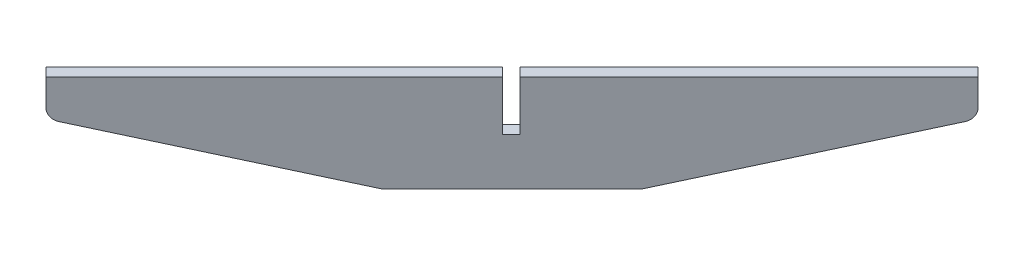
ISO-10303-21;
HEADER;
FILE_DESCRIPTION(('STEP AP214'),'2;1');
FILE_NAME('part.step','',(''),(''),'','','');
FILE_SCHEMA(('AUTOMOTIVE_DESIGN { 1 0 10303 214 1 1 1 1 }'));
ENDSEC;
DATA;
#1=APPLICATION_CONTEXT('core data for automotive mechanical design processes');
#2=APPLICATION_PROTOCOL_DEFINITION('international standard','automotive_design',2000,#1);
#3=PRODUCT_CONTEXT('',#1,'mechanical');
#4=PRODUCT('Part','Part','',(#3));
#5=PRODUCT_RELATED_PRODUCT_CATEGORY('part','',(#4));
#6=PRODUCT_DEFINITION_FORMATION('','',#4);
#7=PRODUCT_DEFINITION_CONTEXT('part definition',#1,'design');
#8=PRODUCT_DEFINITION('design','',#6,#7);
#9=PRODUCT_DEFINITION_SHAPE('','',#8);
#10=(LENGTH_UNIT() NAMED_UNIT(*) SI_UNIT(.MILLI.,.METRE.));
#11=(NAMED_UNIT(*) PLANE_ANGLE_UNIT() SI_UNIT($,.RADIAN.));
#12=(NAMED_UNIT(*) SI_UNIT($,.STERADIAN.) SOLID_ANGLE_UNIT());
#13=UNCERTAINTY_MEASURE_WITH_UNIT(LENGTH_MEASURE(1.E-05),#10,'distance_accuracy_value','');
#14=(GEOMETRIC_REPRESENTATION_CONTEXT(3) GLOBAL_UNCERTAINTY_ASSIGNED_CONTEXT((#13)) GLOBAL_UNIT_ASSIGNED_CONTEXT((#10,
#11,#12)) REPRESENTATION_CONTEXT('',''));
#15=CARTESIAN_POINT('',(0.,0.,0.));
#16=DIRECTION('',(0.,0.,1.));
#17=DIRECTION('',(1.,0.,0.));
#18=AXIS2_PLACEMENT_3D('',#15,#16,#17);
#19=CARTESIAN_POINT('',(0.,15.,0.));
#20=DIRECTION('',(0.,-1.,0.));
#21=DIRECTION('',(0.,0.,-1.));
#22=AXIS2_PLACEMENT_3D('',#19,#20,#21);
#23=PLANE('',#22);
#24=DIRECTION('',(-0.707106781186547,0.,0.707106781186548));
#25=VECTOR('',#24,1.);
#26=CARTESIAN_POINT('',(-195.,15.,187.928932188135));
#27=LINE('',#26,#25);
#28=CARTESIAN_POINT('',(187.928932188135,15.,-195.));
#29=VERTEX_POINT('',#28);
#30=CARTESIAN_POINT('',(-0.234006637984812,15.,-6.83706117388067));
#31=VERTEX_POINT('',#30);
#32=EDGE_CURVE('E228',#29,#31,#27,.T.);
#33=ORIENTED_EDGE('',*,*,#32,.T.);
#34=DIRECTION('',(0.707106781186548,0.,0.707106781186548));
#35=VECTOR('',#34,1.);
#36=CARTESIAN_POINT('',(3.30152726794796,15.,-3.30152726794796));
#37=LINE('',#36,#35);
#38=CARTESIAN_POINT('',(6.83706117388066,15.,0.234006637984791));
#39=VERTEX_POINT('',#38);
#40=EDGE_CURVE('E170',#31,#39,#37,.T.);
#41=ORIENTED_EDGE('',*,*,#40,.T.);
#42=DIRECTION('',(0.707106781186547,0.,-0.707106781186547));
#43=VECTOR('',#42,1.);
#44=CARTESIAN_POINT('',(-187.928932188135,15.,195.));
#45=LINE('',#44,#43);
#46=CARTESIAN_POINT('',(195.,15.,-187.928932188135));
#47=VERTEX_POINT('',#46);
#48=EDGE_CURVE('E232',#39,#47,#45,.T.);
#49=ORIENTED_EDGE('',*,*,#48,.T.);
#50=DIRECTION('',(-0.707106781186547,0.,-0.707106781186547));
#51=VECTOR('',#50,1.);
#52=CARTESIAN_POINT('',(187.928932188135,15.,-195.));
#53=LINE('',#52,#51);
#54=EDGE_CURVE('E235',#47,#29,#53,.T.);
#55=ORIENTED_EDGE('',*,*,#54,.T.);
#56=EDGE_LOOP('',(#33,#41,#49,#55));
#57=FACE_BOUND('',#56,.T.);
#58=ADVANCED_FACE('F35',(#57),#23,.F.);
#59=CARTESIAN_POINT('',(-195.,15.,187.928932188135));
#60=DIRECTION('',(0.707106781186548,0.,0.707106781186547));
#61=DIRECTION('',(0.707106781186547,0.,-0.707106781186548));
#62=AXIS2_PLACEMENT_3D('',#59,#60,#61);
#63=PLANE('',#62);
#64=DIRECTION('',(0.,-1.,0.));
#65=VECTOR('',#64,1.);
#66=CARTESIAN_POINT('',(187.928932188135,15.,-195.));
#67=LINE('',#66,#65);
#68=CARTESIAN_POINT('',(187.928932188135,-7.23300305550614,-195.));
#69=VERTEX_POINT('',#68);
#70=EDGE_CURVE('E200',#29,#69,#67,.T.);
#71=ORIENTED_EDGE('',*,*,#70,.T.);
#72=CARTESIAN_POINT('',(180.857864376269,-7.23300305550614,-187.928932188135));
#73=DIRECTION('',(0.707106781186548,0.,0.707106781186547));
#74=DIRECTION('',(0.707106781186547,0.,-0.707106781186548));
#75=AXIS2_PLACEMENT_3D('',#72,#73,#74);
#76=CIRCLE('',#75,10.);
#77=CARTESIAN_POINT('',(182.60764553352,-16.9219932920304,-189.678713345385));
#78=VERTEX_POINT('',#77);
#79=EDGE_CURVE('E176',#69,#78,#76,.F.);
#80=ORIENTED_EDGE('',*,*,#79,.T.);
#81=DIRECTION('',(0.685115069909655,0.247456424376855,-0.685115069909655));
#82=VECTOR('',#81,1.);
#83=CARTESIAN_POINT('',(187.928932188135,-15.,-195.));
#84=LINE('',#83,#82);
#85=CARTESIAN_POINT('',(49.4974746830583,-65.,-56.5685424949238));
#86=VERTEX_POINT('',#85);
#87=EDGE_CURVE('E210',#86,#78,#84,.T.);
#88=ORIENTED_EDGE('',*,*,#87,.F.);
#89=DIRECTION('',(0.707106781186548,0.,-0.707106781186548));
#90=VECTOR('',#89,1.);
#91=CARTESIAN_POINT('',(49.4974746830583,-65.,-56.5685424949238));
#92=LINE('',#91,#90);
#93=CARTESIAN_POINT('',(-56.5685424949238,-65.,49.4974746830583));
#94=VERTEX_POINT('',#93);
#95=EDGE_CURVE('E219',#94,#86,#92,.T.);
#96=ORIENTED_EDGE('',*,*,#95,.F.);
#97=DIRECTION('',(0.685115069909655,-0.247456424376855,-0.685115069909655));
#98=VECTOR('',#97,1.);
#99=CARTESIAN_POINT('',(-56.5685424949238,-65.,49.4974746830583));
#100=LINE('',#99,#98);
#101=CARTESIAN_POINT('',(-189.678713345385,-16.9219932920304,182.60764553352));
#102=VERTEX_POINT('',#101);
#103=EDGE_CURVE('E134',#102,#94,#100,.T.);
#104=ORIENTED_EDGE('',*,*,#103,.F.);
#105=CARTESIAN_POINT('',(-187.928932188135,-7.23300305550615,180.857864376269));
#106=DIRECTION('',(0.707106781186548,0.,0.707106781186547));
#107=DIRECTION('',(0.707106781186547,0.,-0.707106781186548));
#108=AXIS2_PLACEMENT_3D('',#105,#106,#107);
#109=CIRCLE('',#108,10.);
#110=CARTESIAN_POINT('',(-195.,-7.23300305550615,187.928932188135));
#111=VERTEX_POINT('',#110);
#112=EDGE_CURVE('E174',#102,#111,#109,.F.);
#113=ORIENTED_EDGE('',*,*,#112,.T.);
#114=DIRECTION('',(0.,-1.,0.));
#115=VECTOR('',#114,1.);
#116=CARTESIAN_POINT('',(-195.,15.,187.928932188135));
#117=LINE('',#116,#115);
#118=CARTESIAN_POINT('',(-195.,15.,187.928932188135));
#119=VERTEX_POINT('',#118);
#120=EDGE_CURVE('E189',#119,#111,#117,.T.);
#121=ORIENTED_EDGE('',*,*,#120,.F.);
#122=CARTESIAN_POINT('',(-7.44649580608758,15.,0.375427994222106));
#123=VERTEX_POINT('',#122);
#124=EDGE_CURVE('E148',#123,#119,#27,.T.);
#125=ORIENTED_EDGE('',*,*,#124,.F.);
#126=DIRECTION('',(0.,-1.,0.));
#127=VECTOR('',#126,1.);
#128=CARTESIAN_POINT('',(-7.44649580608753,15.,0.37542799422205));
#129=LINE('',#128,#127);
#130=CARTESIAN_POINT('',(-7.44649580608753,-26.,0.375427994222077));
#131=VERTEX_POINT('',#130);
#132=EDGE_CURVE('E139',#123,#131,#129,.T.);
#133=ORIENTED_EDGE('',*,*,#132,.T.);
#134=DIRECTION('',(0.707106781186547,0.,-0.707106781186548));
#135=VECTOR('',#134,1.);
#136=CARTESIAN_POINT('',(-195.,-26.,187.928932188135));
#137=LINE('',#136,#135);
#138=CARTESIAN_POINT('',(-0.234006637984743,-26.,-6.83706117388072));
#139=VERTEX_POINT('',#138);
#140=EDGE_CURVE('E124',#131,#139,#137,.T.);
#141=ORIENTED_EDGE('',*,*,#140,.T.);
#142=DIRECTION('',(0.,1.,0.));
#143=VECTOR('',#142,1.);
#144=CARTESIAN_POINT('',(-0.234006637984813,15.,-6.83706117388069));
#145=LINE('',#144,#143);
#146=EDGE_CURVE('E135',#139,#31,#145,.T.);
#147=ORIENTED_EDGE('',*,*,#146,.T.);
#148=ORIENTED_EDGE('',*,*,#32,.F.);
#149=EDGE_LOOP('',(#71,#80,#88,#96,#104,#113,#121,#125,#133,#141,#147,#148));
#150=FACE_BOUND('',#149,.T.);
#151=ADVANCED_FACE('F146',(#150),#63,.F.);
#152=CARTESIAN_POINT('',(-195.,15.,187.928932188135));
#153=DIRECTION('',(0.707106781186547,0.,-0.707106781186547));
#154=DIRECTION('',(-0.707106781186548,0.,-0.707106781186548));
#155=AXIS2_PLACEMENT_3D('',#152,#153,#154);
#156=PLANE('',#155);
#157=ORIENTED_EDGE('',*,*,#120,.T.);
#158=DIRECTION('',(0.707106781186548,0.,0.707106781186548));
#159=VECTOR('',#158,1.);
#160=CARTESIAN_POINT('',(-195.,-7.23300305550615,187.928932188135));
#161=LINE('',#160,#159);
#162=CARTESIAN_POINT('',(-187.928932188135,-7.23300305550615,195.));
#163=VERTEX_POINT('',#162);
#164=EDGE_CURVE('E43',#111,#163,#161,.T.);
#165=ORIENTED_EDGE('',*,*,#164,.T.);
#166=DIRECTION('',(0.,-1.,0.));
#167=VECTOR('',#166,1.);
#168=CARTESIAN_POINT('',(-187.928932188135,15.,195.));
#169=LINE('',#168,#167);
#170=CARTESIAN_POINT('',(-187.928932188135,15.,195.));
#171=VERTEX_POINT('',#170);
#172=EDGE_CURVE('E187',#171,#163,#169,.T.);
#173=ORIENTED_EDGE('',*,*,#172,.F.);
#174=DIRECTION('',(0.707106781186548,0.,0.707106781186548));
#175=VECTOR('',#174,1.);
#176=CARTESIAN_POINT('',(-195.,15.,187.928932188135));
#177=LINE('',#176,#175);
#178=EDGE_CURVE('E231',#119,#171,#177,.T.);
#179=ORIENTED_EDGE('',*,*,#178,.F.);
#180=EDGE_LOOP('',(#157,#165,#173,#179));
#181=FACE_BOUND('',#180,.T.);
#182=ADVANCED_FACE('F185',(#181),#156,.F.);
#183=CARTESIAN_POINT('',(-187.928932188135,15.,195.));
#184=DIRECTION('',(-0.707106781186547,0.,-0.707106781186547));
#185=DIRECTION('',(-0.707106781186547,0.,0.707106781186548));
#186=AXIS2_PLACEMENT_3D('',#183,#184,#185);
#187=PLANE('',#186);
#188=DIRECTION('',(0.685115069909655,0.247456424376855,-0.685115069909655));
#189=VECTOR('',#188,1.);
#190=CARTESIAN_POINT('',(195.,-15.,-187.928932188134));
#191=LINE('',#190,#189);
#192=CARTESIAN_POINT('',(56.5685424949238,-65.,-49.4974746830583));
#193=VERTEX_POINT('',#192);
#194=CARTESIAN_POINT('',(189.678713345385,-16.9219932920304,-182.60764553352));
#195=VERTEX_POINT('',#194);
#196=EDGE_CURVE('E213',#193,#195,#191,.T.);
#197=ORIENTED_EDGE('',*,*,#196,.T.);
#198=CARTESIAN_POINT('',(187.928932188135,-7.23300305550614,-180.857864376269));
#199=DIRECTION('',(-0.707106781186547,0.,-0.707106781186547));
#200=DIRECTION('',(-0.707106781186547,0.,0.707106781186548));
#201=AXIS2_PLACEMENT_3D('',#198,#199,#200);
#202=CIRCLE('',#201,10.);
#203=CARTESIAN_POINT('',(195.,-7.23300305550614,-187.928932188135));
#204=VERTEX_POINT('',#203);
#205=EDGE_CURVE('E181',#195,#204,#202,.F.);
#206=ORIENTED_EDGE('',*,*,#205,.T.);
#207=DIRECTION('',(0.,-1.,0.));
#208=VECTOR('',#207,1.);
#209=CARTESIAN_POINT('',(195.,15.,-187.928932188135));
#210=LINE('',#209,#208);
#211=EDGE_CURVE('E195',#47,#204,#210,.T.);
#212=ORIENTED_EDGE('',*,*,#211,.F.);
#213=ORIENTED_EDGE('',*,*,#48,.F.);
#214=DIRECTION('',(0.,-1.,0.));
#215=VECTOR('',#214,1.);
#216=CARTESIAN_POINT('',(6.83706117388072,15.,0.234006637984729));
#217=LINE('',#216,#215);
#218=CARTESIAN_POINT('',(6.83706117388069,-26.,0.234006637984729));
#219=VERTEX_POINT('',#218);
#220=EDGE_CURVE('E149',#39,#219,#217,.T.);
#221=ORIENTED_EDGE('',*,*,#220,.T.);
#222=DIRECTION('',(-0.707106781186547,0.,0.707106781186548));
#223=VECTOR('',#222,1.);
#224=CARTESIAN_POINT('',(-187.928932188135,-26.,195.));
#225=LINE('',#224,#223);
#226=CARTESIAN_POINT('',(-0.37542799422205,-26.,7.44649580608756));
#227=VERTEX_POINT('',#226);
#228=EDGE_CURVE('E165',#219,#227,#225,.T.);
#229=ORIENTED_EDGE('',*,*,#228,.T.);
#230=DIRECTION('',(0.,1.,0.));
#231=VECTOR('',#230,1.);
#232=CARTESIAN_POINT('',(-0.37542799422205,15.,7.4464958060875));
#233=LINE('',#232,#231);
#234=CARTESIAN_POINT('',(-0.375427994222113,15.,7.44649580608756));
#235=VERTEX_POINT('',#234);
#236=EDGE_CURVE('E142',#227,#235,#233,.T.);
#237=ORIENTED_EDGE('',*,*,#236,.T.);
#238=EDGE_CURVE('E194',#171,#235,#45,.T.);
#239=ORIENTED_EDGE('',*,*,#238,.F.);
#240=ORIENTED_EDGE('',*,*,#172,.T.);
#241=CARTESIAN_POINT('',(-180.857864376269,-7.23300305550615,187.928932188135));
#242=DIRECTION('',(-0.707106781186547,0.,-0.707106781186547));
#243=DIRECTION('',(-0.707106781186547,0.,0.707106781186548));
#244=AXIS2_PLACEMENT_3D('',#241,#242,#243);
#245=CIRCLE('',#244,10.);
#246=CARTESIAN_POINT('',(-182.60764553352,-16.9219932920304,189.678713345385));
#247=VERTEX_POINT('',#246);
#248=EDGE_CURVE('E50',#163,#247,#245,.F.);
#249=ORIENTED_EDGE('',*,*,#248,.T.);
#250=DIRECTION('',(0.685115069909655,-0.247456424376855,-0.685115069909655));
#251=VECTOR('',#250,1.);
#252=CARTESIAN_POINT('',(-49.4974746830583,-65.,56.5685424949238));
#253=LINE('',#252,#251);
#254=CARTESIAN_POINT('',(-49.4974746830583,-65.,56.5685424949238));
#255=VERTEX_POINT('',#254);
#256=EDGE_CURVE('E207',#247,#255,#253,.T.);
#257=ORIENTED_EDGE('',*,*,#256,.T.);
#258=DIRECTION('',(0.707106781186548,0.,-0.707106781186548));
#259=VECTOR('',#258,1.);
#260=CARTESIAN_POINT('',(56.5685424949238,-65.,-49.4974746830583));
#261=LINE('',#260,#259);
#262=EDGE_CURVE('E209',#255,#193,#261,.T.);
#263=ORIENTED_EDGE('',*,*,#262,.T.);
#264=EDGE_LOOP('',(#197,#206,#212,#213,#221,#229,#237,#239,#240,#249,#257,#263));
#265=FACE_BOUND('',#264,.T.);
#266=ADVANCED_FACE('F192',(#265),#187,.F.);
#267=CARTESIAN_POINT('',(187.928932188135,15.,-195.));
#268=DIRECTION('',(-0.707106781186547,0.,0.707106781186547));
#269=DIRECTION('',(0.707106781186548,0.,0.707106781186548));
#270=AXIS2_PLACEMENT_3D('',#267,#268,#269);
#271=PLANE('',#270);
#272=ORIENTED_EDGE('',*,*,#211,.T.);
#273=DIRECTION('',(-0.707106781186548,0.,-0.707106781186548));
#274=VECTOR('',#273,1.);
#275=CARTESIAN_POINT('',(187.928932188135,-7.23300305550614,-195.));
#276=LINE('',#275,#274);
#277=EDGE_CURVE('E169',#204,#69,#276,.T.);
#278=ORIENTED_EDGE('',*,*,#277,.T.);
#279=ORIENTED_EDGE('',*,*,#70,.F.);
#280=ORIENTED_EDGE('',*,*,#54,.F.);
#281=EDGE_LOOP('',(#272,#278,#279,#280));
#282=FACE_BOUND('',#281,.T.);
#283=ADVANCED_FACE('F242',(#282),#271,.F.);
#284=ORIENTED_EDGE('',*,*,#238,.T.);
#285=DIRECTION('',(-0.707106781186548,0.,-0.707106781186548));
#286=VECTOR('',#285,1.);
#287=CARTESIAN_POINT('',(-3.91096190015482,15.,3.91096190015482));
#288=LINE('',#287,#286);
#289=EDGE_CURVE('E197',#235,#123,#288,.T.);
#290=ORIENTED_EDGE('',*,*,#289,.T.);
#291=ORIENTED_EDGE('',*,*,#124,.T.);
#292=ORIENTED_EDGE('',*,*,#178,.T.);
#293=EDGE_LOOP('',(#284,#290,#291,#292));
#294=FACE_BOUND('',#293,.T.);
#295=ADVANCED_FACE('F262',(#294),#23,.F.);
#296=CARTESIAN_POINT('',(-49.4974746830583,-65.,56.5685424949238));
#297=DIRECTION('',(0.17497811572505,0.968899023652425,-0.17497811572505));
#298=DIRECTION('',(0.,0.177719921285182,0.984081109247804));
#299=AXIS2_PLACEMENT_3D('',#296,#297,#298);
#300=PLANE('',#299);
#301=ORIENTED_EDGE('',*,*,#256,.F.);
#302=DIRECTION('',(0.707106781186548,0.,0.707106781186548));
#303=VECTOR('',#302,1.);
#304=CARTESIAN_POINT('',(-182.60764553352,-16.9219932920304,189.678713345385));
#305=LINE('',#304,#303);
#306=EDGE_CURVE('E12',#247,#102,#305,.F.);
#307=ORIENTED_EDGE('',*,*,#306,.T.);
#308=ORIENTED_EDGE('',*,*,#103,.T.);
#309=DIRECTION('',(-0.707106781186548,0.,-0.707106781186548));
#310=VECTOR('',#309,1.);
#311=CARTESIAN_POINT('',(-49.4974746830583,-65.,56.5685424949238));
#312=LINE('',#311,#310);
#313=EDGE_CURVE('E225',#255,#94,#312,.T.);
#314=ORIENTED_EDGE('',*,*,#313,.F.);
#315=EDGE_LOOP('',(#301,#307,#308,#314));
#316=FACE_BOUND('',#315,.T.);
#317=ADVANCED_FACE('F260',(#316),#300,.F.);
#318=CARTESIAN_POINT('',(56.5685424949238,-65.,-49.4974746830583));
#319=DIRECTION('',(0.,1.,0.));
#320=DIRECTION('',(0.,0.,1.));
#321=AXIS2_PLACEMENT_3D('',#318,#319,#320);
#322=PLANE('',#321);
#323=ORIENTED_EDGE('',*,*,#95,.T.);
#324=DIRECTION('',(-0.707106781186548,0.,-0.707106781186548));
#325=VECTOR('',#324,1.);
#326=CARTESIAN_POINT('',(56.5685424949238,-65.,-49.4974746830583));
#327=LINE('',#326,#325);
#328=EDGE_CURVE('E216',#193,#86,#327,.T.);
#329=ORIENTED_EDGE('',*,*,#328,.F.);
#330=ORIENTED_EDGE('',*,*,#262,.F.);
#331=ORIENTED_EDGE('',*,*,#313,.T.);
#332=EDGE_LOOP('',(#323,#329,#330,#331));
#333=FACE_BOUND('',#332,.T.);
#334=ADVANCED_FACE('F256',(#333),#322,.F.);
#335=CARTESIAN_POINT('',(195.,-15.,-187.928932188134));
#336=DIRECTION('',(-0.17497811572505,0.968899023652425,0.17497811572505));
#337=DIRECTION('',(0.,-0.177719921285182,0.984081109247804));
#338=AXIS2_PLACEMENT_3D('',#335,#336,#337);
#339=PLANE('',#338);
#340=ORIENTED_EDGE('',*,*,#87,.T.);
#341=DIRECTION('',(-0.707106781186548,0.,-0.707106781186548));
#342=VECTOR('',#341,1.);
#343=CARTESIAN_POINT('',(189.678713345385,-16.9219932920304,-182.60764553352));
#344=LINE('',#343,#342);
#345=EDGE_CURVE('E178',#78,#195,#344,.F.);
#346=ORIENTED_EDGE('',*,*,#345,.T.);
#347=ORIENTED_EDGE('',*,*,#196,.F.);
#348=ORIENTED_EDGE('',*,*,#328,.T.);
#349=EDGE_LOOP('',(#340,#346,#347,#348));
#350=FACE_BOUND('',#349,.T.);
#351=ADVANCED_FACE('F251',(#350),#339,.F.);
#352=CARTESIAN_POINT('',(-198.910961900155,-26.,-191.089038099845));
#353=DIRECTION('',(0.,-1.,0.));
#354=DIRECTION('',(0.,0.,-1.));
#355=AXIS2_PLACEMENT_3D('',#352,#353,#354);
#356=PLANE('',#355);
#357=DIRECTION('',(0.707106781186548,0.,0.707106781186548));
#358=VECTOR('',#357,1.);
#359=CARTESIAN_POINT('',(-198.910961900155,-26.,-191.089038099845));
#360=LINE('',#359,#358);
#361=EDGE_CURVE('E127',#131,#227,#360,.T.);
#362=ORIENTED_EDGE('',*,*,#361,.T.);
#363=ORIENTED_EDGE('',*,*,#228,.F.);
#364=DIRECTION('',(0.707106781186548,0.,0.707106781186548));
#365=VECTOR('',#364,1.);
#366=CARTESIAN_POINT('',(-191.698472732052,-26.,-198.301527267948));
#367=LINE('',#366,#365);
#368=EDGE_CURVE('E130',#139,#219,#367,.T.);
#369=ORIENTED_EDGE('',*,*,#368,.F.);
#370=ORIENTED_EDGE('',*,*,#140,.F.);
#371=EDGE_LOOP('',(#362,#363,#369,#370));
#372=FACE_BOUND('',#371,.T.);
#373=ADVANCED_FACE('F126',(#372),#356,.F.);
#374=CARTESIAN_POINT('',(-191.698472732052,-26.,-198.301527267948));
#375=DIRECTION('',(0.707106781186548,0.,-0.707106781186548));
#376=DIRECTION('',(-0.707106781186548,0.,-0.707106781186548));
#377=AXIS2_PLACEMENT_3D('',#374,#375,#376);
#378=PLANE('',#377);
#379=ORIENTED_EDGE('',*,*,#368,.T.);
#380=ORIENTED_EDGE('',*,*,#220,.F.);
#381=ORIENTED_EDGE('',*,*,#40,.F.);
#382=ORIENTED_EDGE('',*,*,#146,.F.);
#383=EDGE_LOOP('',(#379,#380,#381,#382));
#384=FACE_BOUND('',#383,.T.);
#385=ADVANCED_FACE('F288',(#384),#378,.F.);
#386=CARTESIAN_POINT('',(-198.910961900155,-26.,-191.089038099845));
#387=DIRECTION('',(-0.707106781186548,0.,0.707106781186548));
#388=DIRECTION('',(0.707106781186548,0.,0.707106781186548));
#389=AXIS2_PLACEMENT_3D('',#386,#387,#388);
#390=PLANE('',#389);
#391=ORIENTED_EDGE('',*,*,#289,.F.);
#392=ORIENTED_EDGE('',*,*,#236,.F.);
#393=ORIENTED_EDGE('',*,*,#361,.F.);
#394=ORIENTED_EDGE('',*,*,#132,.F.);
#395=EDGE_LOOP('',(#391,#392,#393,#394));
#396=FACE_BOUND('',#395,.T.);
#397=ADVANCED_FACE('F138',(#396),#390,.F.);
#398=CARTESIAN_POINT('',(180.857864376269,-7.23300305550614,-187.928932188135));
#399=DIRECTION('',(-0.707106781186548,0.,-0.707106781186548));
#400=DIRECTION('',(-0.707106781186548,0.,0.707106781186548));
#401=AXIS2_PLACEMENT_3D('',#398,#399,#400);
#402=CYLINDRICAL_SURFACE('',#401,10.);
#403=ORIENTED_EDGE('',*,*,#205,.F.);
#404=ORIENTED_EDGE('',*,*,#345,.F.);
#405=ORIENTED_EDGE('',*,*,#79,.F.);
#406=ORIENTED_EDGE('',*,*,#277,.F.);
#407=EDGE_LOOP('',(#403,#404,#405,#406));
#408=FACE_BOUND('',#407,.T.);
#409=ADVANCED_FACE('F247',(#408),#402,.T.);
#410=CARTESIAN_POINT('',(-187.928932188135,-7.23300305550615,180.857864376269));
#411=DIRECTION('',(0.707106781186548,0.,0.707106781186548));
#412=DIRECTION('',(0.707106781186548,0.,-0.707106781186548));
#413=AXIS2_PLACEMENT_3D('',#410,#411,#412);
#414=CYLINDRICAL_SURFACE('',#413,10.);
#415=ORIENTED_EDGE('',*,*,#112,.F.);
#416=ORIENTED_EDGE('',*,*,#306,.F.);
#417=ORIENTED_EDGE('',*,*,#248,.F.);
#418=ORIENTED_EDGE('',*,*,#164,.F.);
#419=EDGE_LOOP('',(#415,#416,#417,#418));
#420=FACE_BOUND('',#419,.T.);
#421=ADVANCED_FACE('F37',(#420),#414,.T.);
#422=CLOSED_SHELL('',(#58,#151,#182,#266,#283,#295,#317,#334,#351,#373,#385,#397,#409,#421));
#423=MANIFOLD_SOLID_BREP('B2',#422);
#424=ADVANCED_BREP_SHAPE_REPRESENTATION('',(#18,#423),#14);
#425=SHAPE_DEFINITION_REPRESENTATION(#9,#424);
ENDSEC;
END-ISO-10303-21;
